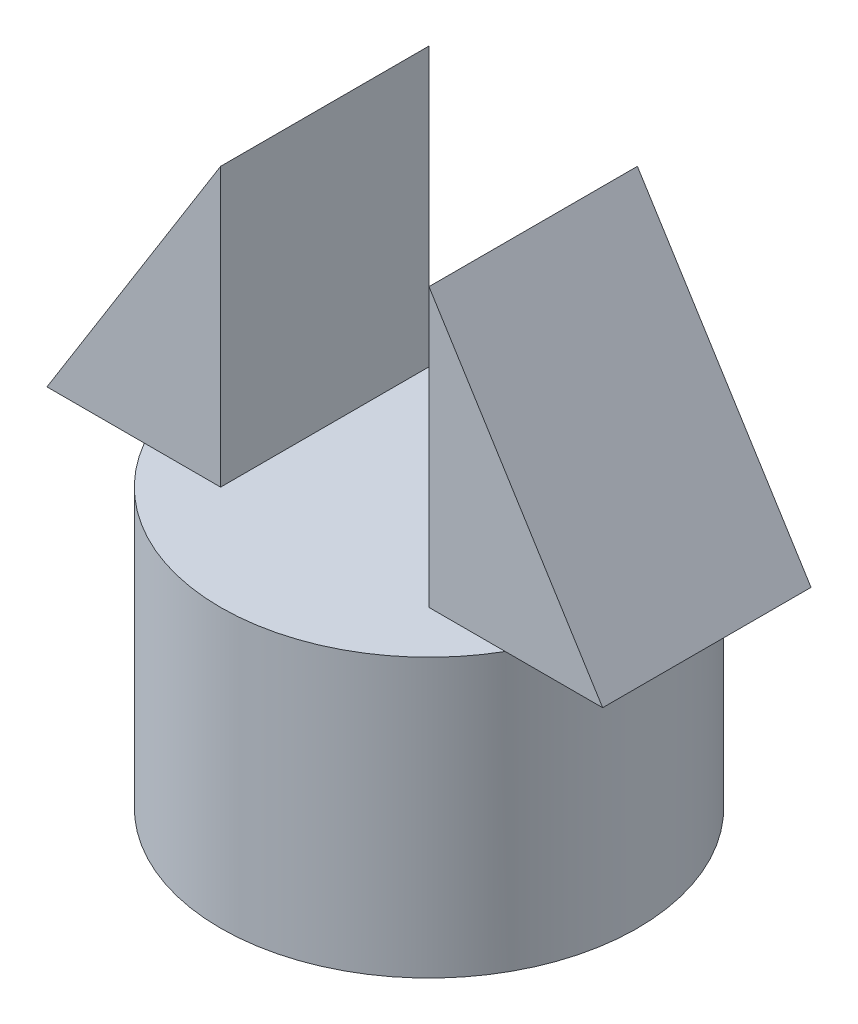
ISO-10303-21;
HEADER;
FILE_DESCRIPTION(('STEP AP214'),'2;1');
FILE_NAME('part.step','',(''),(''),'','','');
FILE_SCHEMA(('AUTOMOTIVE_DESIGN { 1 0 10303 214 1 1 1 1 }'));
ENDSEC;
DATA;
#1=APPLICATION_CONTEXT('core data for automotive mechanical design processes');
#2=APPLICATION_PROTOCOL_DEFINITION('international standard','automotive_design',2000,#1);
#3=PRODUCT_CONTEXT('',#1,'mechanical');
#4=PRODUCT('Part','Part','',(#3));
#5=PRODUCT_RELATED_PRODUCT_CATEGORY('part','',(#4));
#6=PRODUCT_DEFINITION_FORMATION('','',#4);
#7=PRODUCT_DEFINITION_CONTEXT('part definition',#1,'design');
#8=PRODUCT_DEFINITION('design','',#6,#7);
#9=PRODUCT_DEFINITION_SHAPE('','',#8);
#10=(LENGTH_UNIT() NAMED_UNIT(*) SI_UNIT(.MILLI.,.METRE.));
#11=(NAMED_UNIT(*) PLANE_ANGLE_UNIT() SI_UNIT($,.RADIAN.));
#12=(NAMED_UNIT(*) SI_UNIT($,.STERADIAN.) SOLID_ANGLE_UNIT());
#13=UNCERTAINTY_MEASURE_WITH_UNIT(LENGTH_MEASURE(1.E-05),#10,'distance_accuracy_value','');
#14=(GEOMETRIC_REPRESENTATION_CONTEXT(3) GLOBAL_UNCERTAINTY_ASSIGNED_CONTEXT((#13)) GLOBAL_UNIT_ASSIGNED_CONTEXT((#10,
#11,#12)) REPRESENTATION_CONTEXT('',''));
#15=CARTESIAN_POINT('',(0.,0.,0.));
#16=DIRECTION('',(0.,0.,1.));
#17=DIRECTION('',(1.,0.,0.));
#18=AXIS2_PLACEMENT_3D('',#15,#16,#17);
#19=CARTESIAN_POINT('',(0.,40.,0.));
#20=DIRECTION('',(0.,1.,0.));
#21=DIRECTION('',(0.,0.,1.));
#22=AXIS2_PLACEMENT_3D('',#19,#20,#21);
#23=PLANE('',#22);
#24=CARTESIAN_POINT('',(0.,40.,0.));
#25=DIRECTION('',(0.,1.,0.));
#26=DIRECTION('',(0.,0.,1.));
#27=AXIS2_PLACEMENT_3D('',#24,#25,#26);
#28=CIRCLE('',#27,30.);
#29=CARTESIAN_POINT('',(-25.9807621135332,40.,15.));
#30=VERTEX_POINT('',#29);
#31=CARTESIAN_POINT('',(25.9807621135332,40.,15.));
#32=VERTEX_POINT('',#31);
#33=EDGE_CURVE('E160',#30,#32,#28,.T.);
#34=ORIENTED_EDGE('',*,*,#33,.T.);
#35=DIRECTION('',(1.,0.,0.));
#36=VECTOR('',#35,1.);
#37=CARTESIAN_POINT('',(15.,40.,15.));
#38=LINE('',#37,#36);
#39=CARTESIAN_POINT('',(15.,40.,15.));
#40=VERTEX_POINT('',#39);
#41=EDGE_CURVE('E55',#40,#32,#38,.T.);
#42=ORIENTED_EDGE('',*,*,#41,.F.);
#43=DIRECTION('',(0.,0.,-1.));
#44=VECTOR('',#43,1.);
#45=CARTESIAN_POINT('',(15.,40.,15.));
#46=LINE('',#45,#44);
#47=CARTESIAN_POINT('',(15.,40.,-15.));
#48=VERTEX_POINT('',#47);
#49=EDGE_CURVE('E60',#40,#48,#46,.T.);
#50=ORIENTED_EDGE('',*,*,#49,.T.);
#51=DIRECTION('',(1.,0.,0.));
#52=VECTOR('',#51,1.);
#53=CARTESIAN_POINT('',(15.,40.,-15.));
#54=LINE('',#53,#52);
#55=CARTESIAN_POINT('',(25.9807621135332,40.,-15.));
#56=VERTEX_POINT('',#55);
#57=EDGE_CURVE('E133',#48,#56,#54,.T.);
#58=ORIENTED_EDGE('',*,*,#57,.T.);
#59=CARTESIAN_POINT('',(-25.9807621135332,40.,-15.));
#60=VERTEX_POINT('',#59);
#61=EDGE_CURVE('E161',#56,#60,#28,.T.);
#62=ORIENTED_EDGE('',*,*,#61,.T.);
#63=DIRECTION('',(1.,0.,0.));
#64=VECTOR('',#63,1.);
#65=CARTESIAN_POINT('',(-15.,40.,-15.));
#66=LINE('',#65,#64);
#67=CARTESIAN_POINT('',(-15.,40.,-15.));
#68=VERTEX_POINT('',#67);
#69=EDGE_CURVE('E11',#60,#68,#66,.T.);
#70=ORIENTED_EDGE('',*,*,#69,.T.);
#71=DIRECTION('',(0.,0.,-1.));
#72=VECTOR('',#71,1.);
#73=CARTESIAN_POINT('',(-15.,40.,15.));
#74=LINE('',#73,#72);
#75=CARTESIAN_POINT('',(-15.,40.,15.));
#76=VERTEX_POINT('',#75);
#77=EDGE_CURVE('E156',#76,#68,#74,.T.);
#78=ORIENTED_EDGE('',*,*,#77,.F.);
#79=DIRECTION('',(1.,0.,0.));
#80=VECTOR('',#79,1.);
#81=CARTESIAN_POINT('',(-15.,40.,15.));
#82=LINE('',#81,#80);
#83=EDGE_CURVE('E46',#30,#76,#82,.T.);
#84=ORIENTED_EDGE('',*,*,#83,.F.);
#85=EDGE_LOOP('',(#34,#42,#50,#58,#62,#70,#78,#84));
#86=FACE_BOUND('',#85,.T.);
#87=ADVANCED_FACE('F37',(#86),#23,.T.);
#88=CARTESIAN_POINT('',(0.,40.,0.));
#89=DIRECTION('',(0.,-1.,0.));
#90=DIRECTION('',(0.,0.,-1.));
#91=AXIS2_PLACEMENT_3D('',#88,#89,#90);
#92=CYLINDRICAL_SURFACE('',#91,30.);
#93=EDGE_CURVE('E158',#60,#30,#28,.T.);
#94=ORIENTED_EDGE('',*,*,#93,.F.);
#95=ORIENTED_EDGE('',*,*,#61,.F.);
#96=EDGE_CURVE('E166',#32,#56,#28,.T.);
#97=ORIENTED_EDGE('',*,*,#96,.F.);
#98=ORIENTED_EDGE('',*,*,#33,.F.);
#99=EDGE_LOOP('',(#94,#95,#97,#98));
#100=FACE_BOUND('',#99,.T.);
#101=CARTESIAN_POINT('',(0.,0.,0.));
#102=DIRECTION('',(0.,1.,0.));
#103=DIRECTION('',(0.,0.,1.));
#104=AXIS2_PLACEMENT_3D('',#101,#102,#103);
#105=CIRCLE('',#104,30.);
#106=CARTESIAN_POINT('',(0.,0.,30.));
#107=VERTEX_POINT('',#106);
#108=EDGE_CURVE('E41',#107,#107,#105,.T.);
#109=ORIENTED_EDGE('',*,*,#108,.T.);
#110=EDGE_LOOP('',(#109));
#111=FACE_BOUND('',#110,.T.);
#112=ADVANCED_FACE('F39',(#100,#111),#92,.T.);
#113=CARTESIAN_POINT('',(0.,0.,0.));
#114=DIRECTION('',(0.,1.,0.));
#115=DIRECTION('',(0.,0.,1.));
#116=AXIS2_PLACEMENT_3D('',#113,#114,#115);
#117=PLANE('',#116);
#118=ORIENTED_EDGE('',*,*,#108,.F.);
#119=EDGE_LOOP('',(#118));
#120=FACE_BOUND('',#119,.T.);
#121=ADVANCED_FACE('F171',(#120),#117,.F.);
#122=CARTESIAN_POINT('',(-15.,40.,15.));
#123=DIRECTION('',(0.,1.,0.));
#124=DIRECTION('',(-1.,0.,0.));
#125=AXIS2_PLACEMENT_3D('',#122,#123,#124);
#126=PLANE('',#125);
#127=CARTESIAN_POINT('',(-40.,40.,-15.));
#128=VERTEX_POINT('',#127);
#129=EDGE_CURVE('E48',#128,#60,#66,.T.);
#130=ORIENTED_EDGE('',*,*,#129,.T.);
#131=ORIENTED_EDGE('',*,*,#93,.T.);
#132=CARTESIAN_POINT('',(-40.,40.,15.));
#133=VERTEX_POINT('',#132);
#134=EDGE_CURVE('E138',#133,#30,#82,.T.);
#135=ORIENTED_EDGE('',*,*,#134,.F.);
#136=DIRECTION('',(0.,0.,-1.));
#137=VECTOR('',#136,1.);
#138=CARTESIAN_POINT('',(-40.,40.,15.));
#139=LINE('',#138,#137);
#140=EDGE_CURVE('E145',#133,#128,#139,.T.);
#141=ORIENTED_EDGE('',*,*,#140,.T.);
#142=EDGE_LOOP('',(#130,#131,#135,#141));
#143=FACE_BOUND('',#142,.T.);
#144=ADVANCED_FACE('F173',(#143),#126,.F.);
#145=CARTESIAN_POINT('',(-15.,40.,15.));
#146=DIRECTION('',(-1.,0.,0.));
#147=DIRECTION('',(0.,0.,1.));
#148=AXIS2_PLACEMENT_3D('',#145,#146,#147);
#149=PLANE('',#148);
#150=DIRECTION('',(0.,1.,0.));
#151=VECTOR('',#150,1.);
#152=CARTESIAN_POINT('',(-15.,40.,-15.));
#153=LINE('',#152,#151);
#154=CARTESIAN_POINT('',(-15.,80.,-15.));
#155=VERTEX_POINT('',#154);
#156=EDGE_CURVE('E148',#68,#155,#153,.T.);
#157=ORIENTED_EDGE('',*,*,#156,.T.);
#158=DIRECTION('',(0.,0.,-1.));
#159=VECTOR('',#158,1.);
#160=CARTESIAN_POINT('',(-15.,80.,15.));
#161=LINE('',#160,#159);
#162=CARTESIAN_POINT('',(-15.,80.,15.));
#163=VERTEX_POINT('',#162);
#164=EDGE_CURVE('E153',#163,#155,#161,.T.);
#165=ORIENTED_EDGE('',*,*,#164,.F.);
#166=DIRECTION('',(0.,1.,0.));
#167=VECTOR('',#166,1.);
#168=CARTESIAN_POINT('',(-15.,40.,15.));
#169=LINE('',#168,#167);
#170=EDGE_CURVE('E141',#76,#163,#169,.T.);
#171=ORIENTED_EDGE('',*,*,#170,.F.);
#172=ORIENTED_EDGE('',*,*,#77,.T.);
#173=EDGE_LOOP('',(#157,#165,#171,#172));
#174=FACE_BOUND('',#173,.T.);
#175=ADVANCED_FACE('F178',(#174),#149,.F.);
#176=CARTESIAN_POINT('',(-40.,40.,15.));
#177=DIRECTION('',(0.847998304005088,-0.52999894000318,0.));
#178=DIRECTION('',(0.52999894000318,0.847998304005088,0.));
#179=AXIS2_PLACEMENT_3D('',#176,#177,#178);
#180=PLANE('',#179);
#181=DIRECTION('',(-0.52999894000318,-0.847998304005088,0.));
#182=VECTOR('',#181,1.);
#183=CARTESIAN_POINT('',(-40.,40.,-15.));
#184=LINE('',#183,#182);
#185=EDGE_CURVE('E142',#155,#128,#184,.T.);
#186=ORIENTED_EDGE('',*,*,#185,.T.);
#187=ORIENTED_EDGE('',*,*,#140,.F.);
#188=DIRECTION('',(-0.52999894000318,-0.847998304005088,0.));
#189=VECTOR('',#188,1.);
#190=CARTESIAN_POINT('',(-40.,40.,15.));
#191=LINE('',#190,#189);
#192=EDGE_CURVE('E144',#163,#133,#191,.T.);
#193=ORIENTED_EDGE('',*,*,#192,.F.);
#194=ORIENTED_EDGE('',*,*,#164,.T.);
#195=EDGE_LOOP('',(#186,#187,#193,#194));
#196=FACE_BOUND('',#195,.T.);
#197=ADVANCED_FACE('F188',(#196),#180,.F.);
#198=CARTESIAN_POINT('',(0.,0.,15.));
#199=DIRECTION('',(0.,0.,-1.));
#200=DIRECTION('',(-1.,0.,0.));
#201=AXIS2_PLACEMENT_3D('',#198,#199,#200);
#202=PLANE('',#201);
#203=ORIENTED_EDGE('',*,*,#134,.T.);
#204=ORIENTED_EDGE('',*,*,#83,.T.);
#205=ORIENTED_EDGE('',*,*,#170,.T.);
#206=ORIENTED_EDGE('',*,*,#192,.T.);
#207=EDGE_LOOP('',(#203,#204,#205,#206));
#208=FACE_BOUND('',#207,.T.);
#209=ADVANCED_FACE('F192',(#208),#202,.F.);
#210=CARTESIAN_POINT('',(0.,0.,-15.));
#211=DIRECTION('',(0.,0.,-1.));
#212=DIRECTION('',(-1.,0.,0.));
#213=AXIS2_PLACEMENT_3D('',#210,#211,#212);
#214=PLANE('',#213);
#215=ORIENTED_EDGE('',*,*,#129,.F.);
#216=ORIENTED_EDGE('',*,*,#185,.F.);
#217=ORIENTED_EDGE('',*,*,#156,.F.);
#218=ORIENTED_EDGE('',*,*,#69,.F.);
#219=EDGE_LOOP('',(#215,#216,#217,#218));
#220=FACE_BOUND('',#219,.T.);
#221=ADVANCED_FACE('F194',(#220),#214,.T.);
#222=CARTESIAN_POINT('',(15.,40.,15.));
#223=DIRECTION('',(1.,0.,0.));
#224=DIRECTION('',(0.,0.,-1.));
#225=AXIS2_PLACEMENT_3D('',#222,#223,#224);
#226=PLANE('',#225);
#227=DIRECTION('',(0.,-1.,0.));
#228=VECTOR('',#227,1.);
#229=CARTESIAN_POINT('',(15.,40.,-15.));
#230=LINE('',#229,#228);
#231=CARTESIAN_POINT('',(15.,80.,-15.));
#232=VERTEX_POINT('',#231);
#233=EDGE_CURVE('E130',#232,#48,#230,.T.);
#234=ORIENTED_EDGE('',*,*,#233,.T.);
#235=ORIENTED_EDGE('',*,*,#49,.F.);
#236=DIRECTION('',(0.,-1.,0.));
#237=VECTOR('',#236,1.);
#238=CARTESIAN_POINT('',(15.,40.,15.));
#239=LINE('',#238,#237);
#240=CARTESIAN_POINT('',(15.,80.,15.));
#241=VERTEX_POINT('',#240);
#242=EDGE_CURVE('E112',#241,#40,#239,.T.);
#243=ORIENTED_EDGE('',*,*,#242,.F.);
#244=DIRECTION('',(0.,0.,-1.));
#245=VECTOR('',#244,1.);
#246=CARTESIAN_POINT('',(15.,80.,15.));
#247=LINE('',#246,#245);
#248=EDGE_CURVE('E121',#241,#232,#247,.T.);
#249=ORIENTED_EDGE('',*,*,#248,.T.);
#250=EDGE_LOOP('',(#234,#235,#243,#249));
#251=FACE_BOUND('',#250,.T.);
#252=ADVANCED_FACE('F197',(#251),#226,.F.);
#253=CARTESIAN_POINT('',(15.,40.,15.));
#254=DIRECTION('',(0.,1.,0.));
#255=DIRECTION('',(-1.,0.,0.));
#256=AXIS2_PLACEMENT_3D('',#253,#254,#255);
#257=PLANE('',#256);
#258=CARTESIAN_POINT('',(40.,40.,15.));
#259=VERTEX_POINT('',#258);
#260=EDGE_CURVE('E104',#32,#259,#38,.T.);
#261=ORIENTED_EDGE('',*,*,#260,.F.);
#262=ORIENTED_EDGE('',*,*,#96,.T.);
#263=CARTESIAN_POINT('',(40.,40.,-15.));
#264=VERTEX_POINT('',#263);
#265=EDGE_CURVE('E118',#56,#264,#54,.T.);
#266=ORIENTED_EDGE('',*,*,#265,.T.);
#267=DIRECTION('',(0.,0.,-1.));
#268=VECTOR('',#267,1.);
#269=CARTESIAN_POINT('',(40.,40.,15.));
#270=LINE('',#269,#268);
#271=EDGE_CURVE('E115',#259,#264,#270,.T.);
#272=ORIENTED_EDGE('',*,*,#271,.F.);
#273=EDGE_LOOP('',(#261,#262,#266,#272));
#274=FACE_BOUND('',#273,.T.);
#275=ADVANCED_FACE('F116',(#274),#257,.F.);
#276=CARTESIAN_POINT('',(40.,40.,15.));
#277=DIRECTION('',(-0.847998304005088,-0.52999894000318,0.));
#278=DIRECTION('',(0.52999894000318,-0.847998304005088,0.));
#279=AXIS2_PLACEMENT_3D('',#276,#277,#278);
#280=PLANE('',#279);
#281=DIRECTION('',(-0.52999894000318,0.847998304005088,0.));
#282=VECTOR('',#281,1.);
#283=CARTESIAN_POINT('',(40.,40.,-15.));
#284=LINE('',#283,#282);
#285=EDGE_CURVE('E135',#264,#232,#284,.T.);
#286=ORIENTED_EDGE('',*,*,#285,.T.);
#287=ORIENTED_EDGE('',*,*,#248,.F.);
#288=DIRECTION('',(-0.52999894000318,0.847998304005088,0.));
#289=VECTOR('',#288,1.);
#290=CARTESIAN_POINT('',(40.,40.,15.));
#291=LINE('',#290,#289);
#292=EDGE_CURVE('E108',#259,#241,#291,.T.);
#293=ORIENTED_EDGE('',*,*,#292,.F.);
#294=ORIENTED_EDGE('',*,*,#271,.T.);
#295=EDGE_LOOP('',(#286,#287,#293,#294));
#296=FACE_BOUND('',#295,.T.);
#297=ADVANCED_FACE('F123',(#296),#280,.F.);
#298=CARTESIAN_POINT('',(0.,0.,15.));
#299=DIRECTION('',(0.,0.,-1.));
#300=DIRECTION('',(-1.,0.,0.));
#301=AXIS2_PLACEMENT_3D('',#298,#299,#300);
#302=PLANE('',#301);
#303=ORIENTED_EDGE('',*,*,#242,.T.);
#304=ORIENTED_EDGE('',*,*,#41,.T.);
#305=ORIENTED_EDGE('',*,*,#260,.T.);
#306=ORIENTED_EDGE('',*,*,#292,.T.);
#307=EDGE_LOOP('',(#303,#304,#305,#306));
#308=FACE_BOUND('',#307,.T.);
#309=ADVANCED_FACE('F106',(#308),#302,.F.);
#310=CARTESIAN_POINT('',(0.,0.,-15.));
#311=DIRECTION('',(0.,0.,-1.));
#312=DIRECTION('',(-1.,0.,0.));
#313=AXIS2_PLACEMENT_3D('',#310,#311,#312);
#314=PLANE('',#313);
#315=ORIENTED_EDGE('',*,*,#233,.F.);
#316=ORIENTED_EDGE('',*,*,#285,.F.);
#317=ORIENTED_EDGE('',*,*,#265,.F.);
#318=ORIENTED_EDGE('',*,*,#57,.F.);
#319=EDGE_LOOP('',(#315,#316,#317,#318));
#320=FACE_BOUND('',#319,.T.);
#321=ADVANCED_FACE('F209',(#320),#314,.T.);
#322=CLOSED_SHELL('',(#87,#112,#121,#144,#175,#197,#209,#221,#252,#275,#297,#309,#321));
#323=MANIFOLD_SOLID_BREP('B2',#322);
#324=ADVANCED_BREP_SHAPE_REPRESENTATION('',(#18,#323),#14);
#325=SHAPE_DEFINITION_REPRESENTATION(#9,#324);
ENDSEC;
END-ISO-10303-21;
